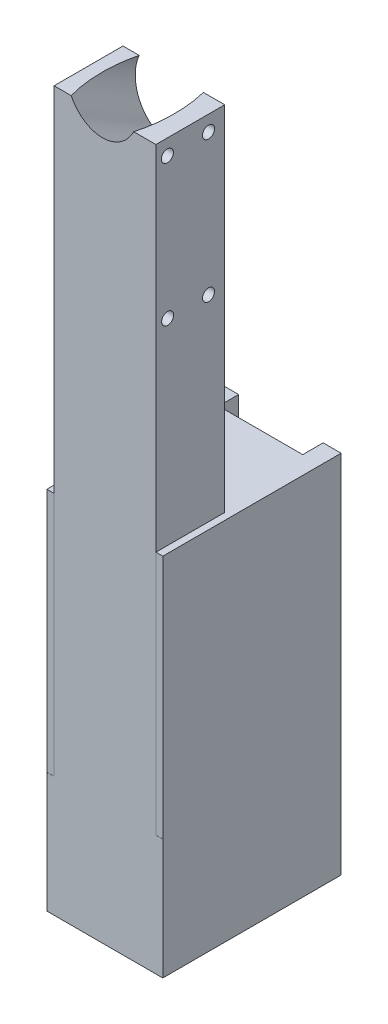
ISO-10303-21;
HEADER;
FILE_DESCRIPTION(('STEP AP214'),'2;1');
FILE_NAME('part.step','',(''),(''),'','','');
FILE_SCHEMA(('AUTOMOTIVE_DESIGN { 1 0 10303 214 1 1 1 1 }'));
ENDSEC;
DATA;
#1=APPLICATION_CONTEXT('core data for automotive mechanical design processes');
#2=APPLICATION_PROTOCOL_DEFINITION('international standard','automotive_design',2000,#1);
#3=PRODUCT_CONTEXT('',#1,'mechanical');
#4=PRODUCT('Part','Part','',(#3));
#5=PRODUCT_RELATED_PRODUCT_CATEGORY('part','',(#4));
#6=PRODUCT_DEFINITION_FORMATION('','',#4);
#7=PRODUCT_DEFINITION_CONTEXT('part definition',#1,'design');
#8=PRODUCT_DEFINITION('design','',#6,#7);
#9=PRODUCT_DEFINITION_SHAPE('','',#8);
#10=(LENGTH_UNIT() NAMED_UNIT(*) SI_UNIT(.MILLI.,.METRE.));
#11=(NAMED_UNIT(*) PLANE_ANGLE_UNIT() SI_UNIT($,.RADIAN.));
#12=(NAMED_UNIT(*) SI_UNIT($,.STERADIAN.) SOLID_ANGLE_UNIT());
#13=UNCERTAINTY_MEASURE_WITH_UNIT(LENGTH_MEASURE(1.E-05),#10,'distance_accuracy_value','');
#14=(GEOMETRIC_REPRESENTATION_CONTEXT(3) GLOBAL_UNCERTAINTY_ASSIGNED_CONTEXT((#13)) GLOBAL_UNIT_ASSIGNED_CONTEXT((#10,
#11,#12)) REPRESENTATION_CONTEXT('',''));
#15=CARTESIAN_POINT('',(0.,0.,0.));
#16=DIRECTION('',(0.,0.,1.));
#17=DIRECTION('',(1.,0.,0.));
#18=AXIS2_PLACEMENT_3D('',#15,#16,#17);
#19=CARTESIAN_POINT('',(19.2072159267695,-16.068623136154,-106.10825784731));
#20=DIRECTION('',(0.,1.,0.));
#21=DIRECTION('',(0.,0.,1.));
#22=AXIS2_PLACEMENT_3D('',#19,#20,#21);
#23=PLANE('',#22);
#24=DIRECTION('',(1.,0.,0.));
#25=VECTOR('',#24,1.);
#26=CARTESIAN_POINT('',(64.4737634161841,-16.068623136154,-158.462370648886));
#27=LINE('',#26,#25);
#28=CARTESIAN_POINT('',(37.2661966694077,-16.068623136154,-158.462370648886));
#29=VERTEX_POINT('',#28);
#30=CARTESIAN_POINT('',(66.1888236800232,-16.068623136154,-158.462370648886));
#31=VERTEX_POINT('',#30);
#32=EDGE_CURVE('E286',#29,#31,#27,.T.);
#33=ORIENTED_EDGE('',*,*,#32,.F.);
#34=DIRECTION('',(0.,0.,1.));
#35=VECTOR('',#34,1.);
#36=CARTESIAN_POINT('',(37.2661966694077,-16.068623136154,-202.871962443775));
#37=LINE('',#36,#35);
#38=CARTESIAN_POINT('',(37.2661966694077,-16.068623136154,-202.871962443775));
#39=VERTEX_POINT('',#38);
#40=EDGE_CURVE('E347',#39,#29,#37,.T.);
#41=ORIENTED_EDGE('',*,*,#40,.F.);
#42=DIRECTION('',(-1.,0.,0.));
#43=VECTOR('',#42,1.);
#44=CARTESIAN_POINT('',(43.7275101747154,-16.068623136154,-202.871962443775));
#45=LINE('',#44,#43);
#46=CARTESIAN_POINT('',(43.7275101747154,-16.068623136154,-202.871962443775));
#47=VERTEX_POINT('',#46);
#48=EDGE_CURVE('E345',#47,#39,#45,.T.);
#49=ORIENTED_EDGE('',*,*,#48,.F.);
#50=DIRECTION('',(0.,0.,-1.));
#51=VECTOR('',#50,1.);
#52=CARTESIAN_POINT('',(43.7275101747154,-16.068623136154,-202.871962443775));
#53=LINE('',#52,#51);
#54=CARTESIAN_POINT('',(43.7275101747154,-16.068623136154,-197.871962443775));
#55=VERTEX_POINT('',#54);
#56=EDGE_CURVE('E343',#55,#47,#53,.T.);
#57=ORIENTED_EDGE('',*,*,#56,.F.);
#58=DIRECTION('',(-1.,0.,0.));
#59=VECTOR('',#58,1.);
#60=CARTESIAN_POINT('',(59.7275101747154,-16.068623136154,-197.871962443775));
#61=LINE('',#60,#59);
#62=CARTESIAN_POINT('',(59.7275101747154,-16.068623136154,-197.871962443775));
#63=VERTEX_POINT('',#62);
#64=EDGE_CURVE('E341',#63,#55,#61,.T.);
#65=ORIENTED_EDGE('',*,*,#64,.F.);
#66=DIRECTION('',(-1.21891695342006E-12,0.,1.));
#67=VECTOR('',#66,1.);
#68=CARTESIAN_POINT('',(59.7275101747154,-16.068623136154,-197.871962443775));
#69=LINE('',#68,#67);
#70=CARTESIAN_POINT('',(59.7275101747217,-16.068623136154,-202.972596182978));
#71=VERTEX_POINT('',#70);
#72=EDGE_CURVE('E339',#71,#63,#69,.T.);
#73=ORIENTED_EDGE('',*,*,#72,.F.);
#74=DIRECTION('',(-1.,0.,0.));
#75=VECTOR('',#74,1.);
#76=CARTESIAN_POINT('',(59.7275101747217,-16.068623136154,-202.972596182978));
#77=LINE('',#76,#75);
#78=CARTESIAN_POINT('',(66.1888236800232,-16.068623136154,-202.972596182978));
#79=VERTEX_POINT('',#78);
#80=EDGE_CURVE('E337',#79,#71,#77,.T.);
#81=ORIENTED_EDGE('',*,*,#80,.F.);
#82=DIRECTION('',(0.,0.,-1.));
#83=VECTOR('',#82,1.);
#84=CARTESIAN_POINT('',(66.1888236800232,-16.068623136154,-158.482956647581));
#85=LINE('',#84,#83);
#86=EDGE_CURVE('E316',#31,#79,#85,.T.);
#87=ORIENTED_EDGE('',*,*,#86,.F.);
#88=EDGE_LOOP('',(#33,#41,#49,#57,#65,#73,#81,#87));
#89=FACE_BOUND('',#88,.T.);
#90=ADVANCED_FACE('F35',(#89),#23,.F.);
#91=CARTESIAN_POINT('',(41.4737634163203,159.320219438313,-161.390944698403));
#92=DIRECTION('',(-1.,0.,0.));
#93=DIRECTION('',(0.,1.,0.));
#94=AXIS2_PLACEMENT_3D('',#91,#92,#93);
#95=PLANE('',#94);
#96=CARTESIAN_POINT('',(41.4737634163203,159.320219438313,-161.390944698403));
#97=DIRECTION('',(1.,0.,0.));
#98=DIRECTION('',(0.,1.,0.));
#99=AXIS2_PLACEMENT_3D('',#96,#97,#98);
#100=CIRCLE('',#99,1.50000000000031);
#101=CARTESIAN_POINT('',(41.4737634163203,160.820219438313,-161.390944698403));
#102=VERTEX_POINT('',#101);
#103=EDGE_CURVE('E240',#102,#102,#100,.T.);
#104=ORIENTED_EDGE('',*,*,#103,.F.);
#105=EDGE_LOOP('',(#104));
#106=FACE_BOUND('',#105,.T.);
#107=ADVANCED_FACE('F497',(#106),#95,.T.);
#108=CARTESIAN_POINT('',(41.4737634163203,159.320219438313,-171.596135726489));
#109=DIRECTION('',(-1.,0.,0.));
#110=DIRECTION('',(0.,1.,0.));
#111=AXIS2_PLACEMENT_3D('',#108,#109,#110);
#112=PLANE('',#111);
#113=CARTESIAN_POINT('',(41.4737634163203,159.320219438313,-171.596135726489));
#114=DIRECTION('',(1.,0.,0.));
#115=DIRECTION('',(0.,1.,0.));
#116=AXIS2_PLACEMENT_3D('',#113,#114,#115);
#117=CIRCLE('',#116,1.50000000000004);
#118=CARTESIAN_POINT('',(41.4737634163203,160.820219438313,-171.596135726489));
#119=VERTEX_POINT('',#118);
#120=EDGE_CURVE('E239',#119,#119,#117,.T.);
#121=ORIENTED_EDGE('',*,*,#120,.F.);
#122=EDGE_LOOP('',(#121));
#123=FACE_BOUND('',#122,.T.);
#124=ADVANCED_FACE('F501',(#123),#112,.T.);
#125=CARTESIAN_POINT('',(46.4737634163201,124.157221503448,-161.390944698403));
#126=DIRECTION('',(-1.,0.,0.));
#127=DIRECTION('',(0.,1.,0.));
#128=AXIS2_PLACEMENT_3D('',#125,#126,#127);
#129=PLANE('',#128);
#130=CARTESIAN_POINT('',(46.4737634163201,124.157221503448,-161.390944698403));
#131=DIRECTION('',(1.,0.,0.));
#132=DIRECTION('',(0.,1.,0.));
#133=AXIS2_PLACEMENT_3D('',#130,#131,#132);
#134=CIRCLE('',#133,1.49999999999993);
#135=CARTESIAN_POINT('',(46.4737634163201,125.657221503448,-161.390944698403));
#136=VERTEX_POINT('',#135);
#137=EDGE_CURVE('E260',#136,#136,#134,.T.);
#138=ORIENTED_EDGE('',*,*,#137,.F.);
#139=EDGE_LOOP('',(#138));
#140=FACE_BOUND('',#139,.T.);
#141=ADVANCED_FACE('F781',(#140),#129,.T.);
#142=CARTESIAN_POINT('',(46.4737634163201,124.157221503448,-171.596135726489));
#143=DIRECTION('',(-1.,0.,0.));
#144=DIRECTION('',(0.,1.,0.));
#145=AXIS2_PLACEMENT_3D('',#142,#143,#144);
#146=PLANE('',#145);
#147=CARTESIAN_POINT('',(46.4737634163201,124.157221503448,-171.596135726489));
#148=DIRECTION('',(1.,0.,0.));
#149=DIRECTION('',(0.,1.,0.));
#150=AXIS2_PLACEMENT_3D('',#147,#148,#149);
#151=CIRCLE('',#150,1.50000000000008);
#152=CARTESIAN_POINT('',(46.4737634163201,125.657221503448,-171.596135726489));
#153=VERTEX_POINT('',#152);
#154=EDGE_CURVE('E259',#153,#153,#151,.T.);
#155=ORIENTED_EDGE('',*,*,#154,.F.);
#156=EDGE_LOOP('',(#155));
#157=FACE_BOUND('',#156,.T.);
#158=ADVANCED_FACE('F771',(#157),#146,.T.);
#159=CARTESIAN_POINT('',(60.8737634163212,159.320219438313,-161.328506709392));
#160=DIRECTION('',(1.,0.,0.));
#161=DIRECTION('',(0.,-1.,0.));
#162=AXIS2_PLACEMENT_3D('',#159,#160,#161);
#163=PLANE('',#162);
#164=CARTESIAN_POINT('',(60.8737634163212,159.320219438313,-161.328506709392));
#165=DIRECTION('',(-1.,0.,0.));
#166=DIRECTION('',(0.,-1.,0.));
#167=AXIS2_PLACEMENT_3D('',#164,#165,#166);
#168=CIRCLE('',#167,1.49999999999987);
#169=CARTESIAN_POINT('',(60.8737634163212,157.820219438313,-161.328506709392));
#170=VERTEX_POINT('',#169);
#171=EDGE_CURVE('E246',#170,#170,#168,.T.);
#172=ORIENTED_EDGE('',*,*,#171,.F.);
#173=EDGE_LOOP('',(#172));
#174=FACE_BOUND('',#173,.T.);
#175=ADVANCED_FACE('F761',(#174),#163,.T.);
#176=CARTESIAN_POINT('',(60.8737634163212,159.320219438313,-171.596135726489));
#177=DIRECTION('',(1.,0.,0.));
#178=DIRECTION('',(0.,-1.,0.));
#179=AXIS2_PLACEMENT_3D('',#176,#177,#178);
#180=PLANE('',#179);
#181=CARTESIAN_POINT('',(60.8737634163212,159.320219438313,-171.596135726489));
#182=DIRECTION('',(-1.,0.,0.));
#183=DIRECTION('',(0.,-1.,0.));
#184=AXIS2_PLACEMENT_3D('',#181,#182,#183);
#185=CIRCLE('',#184,1.50000000000009);
#186=CARTESIAN_POINT('',(60.8737634163212,157.820219438313,-171.596135726489));
#187=VERTEX_POINT('',#186);
#188=EDGE_CURVE('E250',#187,#187,#185,.T.);
#189=ORIENTED_EDGE('',*,*,#188,.F.);
#190=EDGE_LOOP('',(#189));
#191=FACE_BOUND('',#190,.T.);
#192=ADVANCED_FACE('F751',(#191),#180,.T.);
#193=CARTESIAN_POINT('',(55.8737634163213,124.157221503448,-171.596135726489));
#194=DIRECTION('',(1.,0.,0.));
#195=DIRECTION('',(0.,-1.,0.));
#196=AXIS2_PLACEMENT_3D('',#193,#194,#195);
#197=PLANE('',#196);
#198=CARTESIAN_POINT('',(55.8737634163213,124.157221503448,-171.596135726489));
#199=DIRECTION('',(-1.,0.,0.));
#200=DIRECTION('',(0.,-1.,0.));
#201=AXIS2_PLACEMENT_3D('',#198,#199,#200);
#202=CIRCLE('',#201,1.50000000000002);
#203=CARTESIAN_POINT('',(55.8737634163213,122.657221503448,-171.596135726489));
#204=VERTEX_POINT('',#203);
#205=EDGE_CURVE('E266',#204,#204,#202,.T.);
#206=ORIENTED_EDGE('',*,*,#205,.F.);
#207=EDGE_LOOP('',(#206));
#208=FACE_BOUND('',#207,.T.);
#209=ADVANCED_FACE('F741',(#208),#197,.T.);
#210=CARTESIAN_POINT('',(55.8737634163213,124.157221503448,-161.390944698403));
#211=DIRECTION('',(1.,0.,0.));
#212=DIRECTION('',(0.,-1.,0.));
#213=AXIS2_PLACEMENT_3D('',#210,#211,#212);
#214=PLANE('',#213);
#215=CARTESIAN_POINT('',(55.8737634163213,124.157221503448,-161.390944698403));
#216=DIRECTION('',(-1.,0.,0.));
#217=DIRECTION('',(0.,-1.,0.));
#218=AXIS2_PLACEMENT_3D('',#215,#216,#217);
#219=CIRCLE('',#218,1.49999999999989);
#220=CARTESIAN_POINT('',(55.8737634163213,122.657221503448,-161.390944698403));
#221=VERTEX_POINT('',#220);
#222=EDGE_CURVE('E270',#221,#221,#219,.T.);
#223=ORIENTED_EDGE('',*,*,#222,.F.);
#224=EDGE_LOOP('',(#223));
#225=FACE_BOUND('',#224,.T.);
#226=ADVANCED_FACE('F533',(#225),#214,.T.);
#227=CARTESIAN_POINT('',(51.1275101841724,17.3425690277442,-192.871962443775));
#228=DIRECTION('',(0.,0.,-1.));
#229=DIRECTION('',(0.,1.,0.));
#230=AXIS2_PLACEMENT_3D('',#227,#228,#229);
#231=PLANE('',#230);
#232=CARTESIAN_POINT('',(51.1275101841724,17.3425690277442,-192.871962443775));
#233=DIRECTION('',(0.,0.,-1.));
#234=DIRECTION('',(0.,1.,0.));
#235=AXIS2_PLACEMENT_3D('',#232,#233,#234);
#236=CIRCLE('',#235,1.40000000000023);
#237=CARTESIAN_POINT('',(51.1275101841724,18.7425690277445,-192.871962443775));
#238=VERTEX_POINT('',#237);
#239=EDGE_CURVE('E313',#238,#238,#236,.T.);
#240=ORIENTED_EDGE('',*,*,#239,.T.);
#241=EDGE_LOOP('',(#240));
#242=FACE_BOUND('',#241,.T.);
#243=ADVANCED_FACE('F524',(#242),#231,.T.);
#244=CARTESIAN_POINT('',(51.1275101841715,63.1425690277441,-192.871962443775));
#245=DIRECTION('',(0.,0.,-1.));
#246=DIRECTION('',(0.,1.,0.));
#247=AXIS2_PLACEMENT_3D('',#244,#245,#246);
#248=PLANE('',#247);
#249=CARTESIAN_POINT('',(51.1275101841715,63.1425690277441,-192.871962443775));
#250=DIRECTION('',(0.,0.,-1.));
#251=DIRECTION('',(0.,1.,0.));
#252=AXIS2_PLACEMENT_3D('',#249,#250,#251);
#253=CIRCLE('',#252,1.40000000000023);
#254=CARTESIAN_POINT('',(51.1275101841715,64.5425690277443,-192.871962443775));
#255=VERTEX_POINT('',#254);
#256=EDGE_CURVE('E307',#255,#255,#253,.T.);
#257=ORIENTED_EDGE('',*,*,#256,.T.);
#258=EDGE_LOOP('',(#257));
#259=FACE_BOUND('',#258,.T.);
#260=ADVANCED_FACE('F520',(#259),#248,.T.);
#261=CARTESIAN_POINT('',(41.4737634163203,159.320219438313,-161.390944698403));
#262=DIRECTION('',(-1.,0.,0.));
#263=DIRECTION('',(0.,-1.,0.));
#264=AXIS2_PLACEMENT_3D('',#261,#262,#263);
#265=CYLINDRICAL_SURFACE('',#264,1.50000000000031);
#266=ORIENTED_EDGE('',*,*,#103,.T.);
#267=EDGE_LOOP('',(#266));
#268=FACE_BOUND('',#267,.T.);
#269=CARTESIAN_POINT('',(39.0737634161828,159.320219438313,-161.390944698403));
#270=DIRECTION('',(1.,0.,0.));
#271=DIRECTION('',(0.,1.,0.));
#272=AXIS2_PLACEMENT_3D('',#269,#270,#271);
#273=CIRCLE('',#272,1.50000000000031);
#274=CARTESIAN_POINT('',(39.0737634161828,160.820219438313,-161.390944698403));
#275=VERTEX_POINT('',#274);
#276=EDGE_CURVE('E253',#275,#275,#273,.F.);
#277=ORIENTED_EDGE('',*,*,#276,.T.);
#278=EDGE_LOOP('',(#277));
#279=FACE_BOUND('',#278,.T.);
#280=ADVANCED_FACE('F523',(#268,#279),#265,.F.);
#281=CARTESIAN_POINT('',(41.4737634163203,159.320219438313,-171.596135726489));
#282=DIRECTION('',(-1.,0.,0.));
#283=DIRECTION('',(0.,-1.,0.));
#284=AXIS2_PLACEMENT_3D('',#281,#282,#283);
#285=CYLINDRICAL_SURFACE('',#284,1.50000000000004);
#286=ORIENTED_EDGE('',*,*,#120,.T.);
#287=EDGE_LOOP('',(#286));
#288=FACE_BOUND('',#287,.T.);
#289=CARTESIAN_POINT('',(39.0737634161828,159.320219438313,-171.596135726489));
#290=DIRECTION('',(1.,0.,0.));
#291=DIRECTION('',(0.,1.,0.));
#292=AXIS2_PLACEMENT_3D('',#289,#290,#291);
#293=CIRCLE('',#292,1.50000000000004);
#294=CARTESIAN_POINT('',(39.0737634161828,160.820219438313,-171.596135726489));
#295=VERTEX_POINT('',#294);
#296=EDGE_CURVE('E243',#295,#295,#293,.F.);
#297=ORIENTED_EDGE('',*,*,#296,.T.);
#298=EDGE_LOOP('',(#297));
#299=FACE_BOUND('',#298,.T.);
#300=ADVANCED_FACE('F701',(#288,#299),#285,.F.);
#301=CARTESIAN_POINT('',(23.4737634163205,124.157221503448,-161.390944698403));
#302=DIRECTION('',(1.,0.,0.));
#303=DIRECTION('',(0.,1.,0.));
#304=AXIS2_PLACEMENT_3D('',#301,#302,#303);
#305=CYLINDRICAL_SURFACE('',#304,1.49999999999993);
#306=ORIENTED_EDGE('',*,*,#137,.T.);
#307=EDGE_LOOP('',(#306));
#308=FACE_BOUND('',#307,.T.);
#309=CARTESIAN_POINT('',(39.0737634161828,124.157221503448,-161.390944698403));
#310=DIRECTION('',(1.,0.,0.));
#311=DIRECTION('',(0.,1.,0.));
#312=AXIS2_PLACEMENT_3D('',#309,#310,#311);
#313=CIRCLE('',#312,1.49999999999993);
#314=CARTESIAN_POINT('',(39.0737634161828,125.657221503448,-161.390944698403));
#315=VERTEX_POINT('',#314);
#316=EDGE_CURVE('E273',#315,#315,#313,.T.);
#317=ORIENTED_EDGE('',*,*,#316,.F.);
#318=EDGE_LOOP('',(#317));
#319=FACE_BOUND('',#318,.T.);
#320=ADVANCED_FACE('F691',(#308,#319),#305,.F.);
#321=CARTESIAN_POINT('',(23.4737634163205,124.157221503448,-171.596135726489));
#322=DIRECTION('',(1.,0.,0.));
#323=DIRECTION('',(0.,1.,0.));
#324=AXIS2_PLACEMENT_3D('',#321,#322,#323);
#325=CYLINDRICAL_SURFACE('',#324,1.50000000000008);
#326=ORIENTED_EDGE('',*,*,#154,.T.);
#327=EDGE_LOOP('',(#326));
#328=FACE_BOUND('',#327,.T.);
#329=CARTESIAN_POINT('',(39.0737634161828,124.157221503448,-171.596135726489));
#330=DIRECTION('',(1.,0.,0.));
#331=DIRECTION('',(0.,1.,0.));
#332=AXIS2_PLACEMENT_3D('',#329,#330,#331);
#333=CIRCLE('',#332,1.50000000000008);
#334=CARTESIAN_POINT('',(39.0737634161828,125.657221503448,-171.596135726489));
#335=VERTEX_POINT('',#334);
#336=EDGE_CURVE('E263',#335,#335,#333,.T.);
#337=ORIENTED_EDGE('',*,*,#336,.F.);
#338=EDGE_LOOP('',(#337));
#339=FACE_BOUND('',#338,.T.);
#340=ADVANCED_FACE('F519',(#328,#339),#325,.F.);
#341=CARTESIAN_POINT('',(64.4737634161841,193.866566084655,-175.642963086767));
#342=DIRECTION('',(0.,0.,1.));
#343=DIRECTION('',(0.,-1.,0.));
#344=AXIS2_PLACEMENT_3D('',#341,#342,#343);
#345=PLANE('',#344);
#346=CARTESIAN_POINT('',(51.1332311807804,158.467282147258,-175.642963086767));
#347=DIRECTION('',(0.,0.,1.));
#348=DIRECTION('',(0.,1.,0.));
#349=AXIS2_PLACEMENT_3D('',#346,#347,#348);
#350=ELLIPSE('',#349,10.3923048454137,9.00000000000035);
#351=CARTESIAN_POINT('',(59.1450237592159,163.20172047088,-175.642963086767));
#352=VERTEX_POINT('',#351);
#353=CARTESIAN_POINT('',(43.1214386023449,163.20172047088,-175.642963086767));
#354=VERTEX_POINT('',#353);
#355=EDGE_CURVE('E254',#352,#354,#350,.F.);
#356=ORIENTED_EDGE('',*,*,#355,.F.);
#357=DIRECTION('',(1.,0.,0.));
#358=VECTOR('',#357,1.);
#359=CARTESIAN_POINT('',(64.4737634161841,163.20172047088,-175.642963086767));
#360=LINE('',#359,#358);
#361=CARTESIAN_POINT('',(64.4737634161841,163.20172047088,-175.642963086767));
#362=VERTEX_POINT('',#361);
#363=EDGE_CURVE('E281',#352,#362,#360,.T.);
#364=ORIENTED_EDGE('',*,*,#363,.T.);
#365=DIRECTION('',(0.,-1.,0.));
#366=VECTOR('',#365,1.);
#367=CARTESIAN_POINT('',(64.4737634161841,193.866566084655,-175.642963086767));
#368=LINE('',#367,#366);
#369=CARTESIAN_POINT('',(64.4737634161841,75.0913768638464,-175.642963086767));
#370=VERTEX_POINT('',#369);
#371=EDGE_CURVE('E289',#362,#370,#368,.T.);
#372=ORIENTED_EDGE('',*,*,#371,.T.);
#373=DIRECTION('',(1.,0.,0.));
#374=VECTOR('',#373,1.);
#375=CARTESIAN_POINT('',(-4650.0806785395,75.0913768638464,-175.642963086767));
#376=LINE('',#375,#374);
#377=CARTESIAN_POINT('',(39.0737634161828,75.0913768638464,-175.642963086767));
#378=VERTEX_POINT('',#377);
#379=EDGE_CURVE('E369',#378,#370,#376,.T.);
#380=ORIENTED_EDGE('',*,*,#379,.F.);
#381=DIRECTION('',(0.,-1.,0.));
#382=VECTOR('',#381,1.);
#383=CARTESIAN_POINT('',(39.0737634161828,193.866566084655,-175.642963086767));
#384=LINE('',#383,#382);
#385=CARTESIAN_POINT('',(39.0737634161828,163.20172047088,-175.642963086767));
#386=VERTEX_POINT('',#385);
#387=EDGE_CURVE('E297',#386,#378,#384,.T.);
#388=ORIENTED_EDGE('',*,*,#387,.F.);
#389=EDGE_CURVE('E282',#386,#354,#360,.T.);
#390=ORIENTED_EDGE('',*,*,#389,.T.);
#391=EDGE_LOOP('',(#356,#364,#372,#380,#388,#390));
#392=FACE_BOUND('',#391,.T.);
#393=ADVANCED_FACE('F407',(#392),#345,.F.);
#394=CARTESIAN_POINT('',(66.8737634163215,159.320219438313,-161.328506709392));
#395=DIRECTION('',(-1.,0.,0.));
#396=DIRECTION('',(0.,-1.,0.));
#397=AXIS2_PLACEMENT_3D('',#394,#395,#396);
#398=CYLINDRICAL_SURFACE('',#397,1.49999999999987);
#399=ORIENTED_EDGE('',*,*,#171,.T.);
#400=EDGE_LOOP('',(#399));
#401=FACE_BOUND('',#400,.T.);
#402=CARTESIAN_POINT('',(64.4737634161841,159.320219438313,-161.328506709392));
#403=DIRECTION('',(-1.,0.,0.));
#404=DIRECTION('',(0.,-1.,0.));
#405=AXIS2_PLACEMENT_3D('',#402,#403,#404);
#406=CIRCLE('',#405,1.49999999999987);
#407=CARTESIAN_POINT('',(64.4737634161841,157.820219438313,-161.328506709392));
#408=VERTEX_POINT('',#407);
#409=EDGE_CURVE('E257',#408,#408,#406,.T.);
#410=ORIENTED_EDGE('',*,*,#409,.F.);
#411=EDGE_LOOP('',(#410));
#412=FACE_BOUND('',#411,.T.);
#413=ADVANCED_FACE('F518',(#401,#412),#398,.F.);
#414=CARTESIAN_POINT('',(66.8737634163215,159.320219438313,-171.596135726489));
#415=DIRECTION('',(-1.,0.,0.));
#416=DIRECTION('',(0.,-1.,0.));
#417=AXIS2_PLACEMENT_3D('',#414,#415,#416);
#418=CYLINDRICAL_SURFACE('',#417,1.50000000000009);
#419=ORIENTED_EDGE('',*,*,#188,.T.);
#420=EDGE_LOOP('',(#419));
#421=FACE_BOUND('',#420,.T.);
#422=CARTESIAN_POINT('',(64.4737634161841,159.320219438313,-171.596135726489));
#423=DIRECTION('',(-1.,0.,0.));
#424=DIRECTION('',(0.,-1.,0.));
#425=AXIS2_PLACEMENT_3D('',#422,#423,#424);
#426=CIRCLE('',#425,1.50000000000009);
#427=CARTESIAN_POINT('',(64.4737634161841,157.820219438313,-171.596135726489));
#428=VERTEX_POINT('',#427);
#429=EDGE_CURVE('E249',#428,#428,#426,.T.);
#430=ORIENTED_EDGE('',*,*,#429,.F.);
#431=EDGE_LOOP('',(#430));
#432=FACE_BOUND('',#431,.T.);
#433=ADVANCED_FACE('F657',(#421,#432),#418,.F.);
#434=CARTESIAN_POINT('',(81.5682094183554,124.157221503448,-171.596135726489));
#435=DIRECTION('',(-1.,0.,0.));
#436=DIRECTION('',(0.,-1.,0.));
#437=AXIS2_PLACEMENT_3D('',#434,#435,#436);
#438=CYLINDRICAL_SURFACE('',#437,1.50000000000002);
#439=ORIENTED_EDGE('',*,*,#205,.T.);
#440=EDGE_LOOP('',(#439));
#441=FACE_BOUND('',#440,.T.);
#442=CARTESIAN_POINT('',(64.4737634161841,124.157221503448,-171.596135726489));
#443=DIRECTION('',(-1.,0.,0.));
#444=DIRECTION('',(0.,-1.,0.));
#445=AXIS2_PLACEMENT_3D('',#442,#443,#444);
#446=CIRCLE('',#445,1.50000000000002);
#447=CARTESIAN_POINT('',(64.4737634161841,122.657221503448,-171.596135726489));
#448=VERTEX_POINT('',#447);
#449=EDGE_CURVE('E290',#448,#448,#446,.T.);
#450=ORIENTED_EDGE('',*,*,#449,.F.);
#451=EDGE_LOOP('',(#450));
#452=FACE_BOUND('',#451,.T.);
#453=ADVANCED_FACE('F646',(#441,#452),#438,.F.);
#454=CARTESIAN_POINT('',(81.5682094183554,124.157221503448,-161.390944698403));
#455=DIRECTION('',(-1.,0.,0.));
#456=DIRECTION('',(0.,-1.,0.));
#457=AXIS2_PLACEMENT_3D('',#454,#455,#456);
#458=CYLINDRICAL_SURFACE('',#457,1.49999999999989);
#459=ORIENTED_EDGE('',*,*,#222,.T.);
#460=EDGE_LOOP('',(#459));
#461=FACE_BOUND('',#460,.T.);
#462=CARTESIAN_POINT('',(64.4737634161841,124.157221503448,-161.390944698403));
#463=DIRECTION('',(-1.,0.,0.));
#464=DIRECTION('',(0.,-1.,0.));
#465=AXIS2_PLACEMENT_3D('',#462,#463,#464);
#466=CIRCLE('',#465,1.49999999999989);
#467=CARTESIAN_POINT('',(64.4737634161841,122.657221503448,-161.390944698403));
#468=VERTEX_POINT('',#467);
#469=EDGE_CURVE('E269',#468,#468,#466,.T.);
#470=ORIENTED_EDGE('',*,*,#469,.F.);
#471=EDGE_LOOP('',(#470));
#472=FACE_BOUND('',#471,.T.);
#473=ADVANCED_FACE('F539',(#461,#472),#458,.F.);
#474=CARTESIAN_POINT('',(59.7275101747154,75.0913768638464,-158.482956647581));
#475=DIRECTION('',(0.,0.,-1.));
#476=DIRECTION('',(0.,1.,0.));
#477=AXIS2_PLACEMENT_3D('',#474,#475,#476);
#478=PLANE('',#477);
#479=DIRECTION('',(1.,0.,0.));
#480=VECTOR('',#479,1.);
#481=CARTESIAN_POINT('',(37.2661966694077,13.9313768638463,-158.482956647581));
#482=LINE('',#481,#480);
#483=CARTESIAN_POINT('',(64.4737634161841,13.9313768638463,-158.482956647581));
#484=VERTEX_POINT('',#483);
#485=CARTESIAN_POINT('',(66.1888236800232,13.9313768638463,-158.482956647581));
#486=VERTEX_POINT('',#485);
#487=EDGE_CURVE('E213',#484,#486,#482,.T.);
#488=ORIENTED_EDGE('',*,*,#487,.T.);
#489=DIRECTION('',(0.,-1.,0.));
#490=VECTOR('',#489,1.);
#491=CARTESIAN_POINT('',(66.1888236800232,75.0913768638464,-158.482956647581));
#492=LINE('',#491,#490);
#493=CARTESIAN_POINT('',(66.1888236800232,75.0913768638464,-158.482956647581));
#494=VERTEX_POINT('',#493);
#495=EDGE_CURVE('E366',#494,#486,#492,.T.);
#496=ORIENTED_EDGE('',*,*,#495,.F.);
#497=DIRECTION('',(1.,0.,0.));
#498=VECTOR('',#497,1.);
#499=CARTESIAN_POINT('',(59.7275101747154,75.0913768638464,-158.482956647581));
#500=LINE('',#499,#498);
#501=CARTESIAN_POINT('',(64.4737634161841,75.0913768638464,-158.482956647581));
#502=VERTEX_POINT('',#501);
#503=EDGE_CURVE('E323',#502,#494,#500,.T.);
#504=ORIENTED_EDGE('',*,*,#503,.F.);
#505=DIRECTION('',(0.,1.,0.));
#506=VECTOR('',#505,1.);
#507=CARTESIAN_POINT('',(64.4737634161841,75.0913768638464,-158.482956647581));
#508=LINE('',#507,#506);
#509=EDGE_CURVE('E304',#484,#502,#508,.T.);
#510=ORIENTED_EDGE('',*,*,#509,.F.);
#511=EDGE_LOOP('',(#488,#496,#504,#510));
#512=FACE_BOUND('',#511,.T.);
#513=ADVANCED_FACE('F455',(#512),#478,.F.);
#514=CARTESIAN_POINT('',(59.7275101747217,75.0913768638464,-202.972596182978));
#515=DIRECTION('',(0.,0.,1.));
#516=DIRECTION('',(0.,-1.,0.));
#517=AXIS2_PLACEMENT_3D('',#514,#515,#516);
#518=PLANE('',#517);
#519=DIRECTION('',(0.,-1.,0.));
#520=VECTOR('',#519,1.);
#521=CARTESIAN_POINT('',(59.7275101747217,75.0913768638464,-202.972596182978));
#522=LINE('',#521,#520);
#523=CARTESIAN_POINT('',(59.7275101747217,3.30098404346657,-202.972596182978));
#524=VERTEX_POINT('',#523);
#525=EDGE_CURVE('E360',#524,#71,#522,.T.);
#526=ORIENTED_EDGE('',*,*,#525,.F.);
#527=DIRECTION('',(-1.,0.,0.));
#528=VECTOR('',#527,1.);
#529=CARTESIAN_POINT('',(61.7050715411658,3.30098404346657,-202.972596182978));
#530=LINE('',#529,#528);
#531=CARTESIAN_POINT('',(61.7050715411658,3.30098404346657,-202.972596182978));
#532=VERTEX_POINT('',#531);
#533=EDGE_CURVE('E49',#532,#524,#530,.T.);
#534=ORIENTED_EDGE('',*,*,#533,.F.);
#535=DIRECTION('',(0.,-1.,0.));
#536=VECTOR('',#535,1.);
#537=CARTESIAN_POINT('',(61.7050715411658,75.0913768638464,-202.972596182978));
#538=LINE('',#537,#536);
#539=CARTESIAN_POINT('',(61.7050715411658,75.0913768638464,-202.972596182978));
#540=VERTEX_POINT('',#539);
#541=EDGE_CURVE('E462',#540,#532,#538,.T.);
#542=ORIENTED_EDGE('',*,*,#541,.F.);
#543=DIRECTION('',(-1.,0.,0.));
#544=VECTOR('',#543,1.);
#545=CARTESIAN_POINT('',(59.7275101747217,75.0913768638464,-202.972596182978));
#546=LINE('',#545,#544);
#547=CARTESIAN_POINT('',(66.1888236800232,75.0913768638464,-202.972596182978));
#548=VERTEX_POINT('',#547);
#549=EDGE_CURVE('E325',#548,#540,#546,.T.);
#550=ORIENTED_EDGE('',*,*,#549,.F.);
#551=DIRECTION('',(0.,-1.,0.));
#552=VECTOR('',#551,1.);
#553=CARTESIAN_POINT('',(66.1888236800232,75.0913768638464,-202.972596182978));
#554=LINE('',#553,#552);
#555=EDGE_CURVE('E363',#548,#79,#554,.T.);
#556=ORIENTED_EDGE('',*,*,#555,.T.);
#557=ORIENTED_EDGE('',*,*,#80,.T.);
#558=EDGE_LOOP('',(#526,#534,#542,#550,#556,#557));
#559=FACE_BOUND('',#558,.T.);
#560=ADVANCED_FACE('F460',(#559),#518,.F.);
#561=CARTESIAN_POINT('',(51.1275101841724,17.3425690277442,-192.871962443775));
#562=DIRECTION('',(0.,0.,-1.));
#563=DIRECTION('',(0.,1.,0.));
#564=AXIS2_PLACEMENT_3D('',#561,#562,#563);
#565=CYLINDRICAL_SURFACE('',#564,1.40000000000023);
#566=ORIENTED_EDGE('',*,*,#239,.F.);
#567=EDGE_LOOP('',(#566));
#568=FACE_BOUND('',#567,.T.);
#569=CARTESIAN_POINT('',(51.1275101841724,17.3425690277442,-197.871962443775));
#570=DIRECTION('',(0.,0.,-1.));
#571=DIRECTION('',(0.,1.,0.));
#572=AXIS2_PLACEMENT_3D('',#569,#570,#571);
#573=CIRCLE('',#572,1.40000000000023);
#574=CARTESIAN_POINT('',(51.1275101841724,18.7425690277445,-197.871962443775));
#575=VERTEX_POINT('',#574);
#576=EDGE_CURVE('E310',#575,#575,#573,.T.);
#577=ORIENTED_EDGE('',*,*,#576,.T.);
#578=EDGE_LOOP('',(#577));
#579=FACE_BOUND('',#578,.T.);
#580=ADVANCED_FACE('F529',(#568,#579),#565,.F.);
#581=CARTESIAN_POINT('',(51.1275101841715,63.1425690277441,-192.871962443775));
#582=DIRECTION('',(0.,0.,-1.));
#583=DIRECTION('',(0.,1.,0.));
#584=AXIS2_PLACEMENT_3D('',#581,#582,#583);
#585=CYLINDRICAL_SURFACE('',#584,1.40000000000023);
#586=ORIENTED_EDGE('',*,*,#256,.F.);
#587=EDGE_LOOP('',(#586));
#588=FACE_BOUND('',#587,.T.);
#589=CARTESIAN_POINT('',(51.1275101841715,63.1425690277441,-197.871962443775));
#590=DIRECTION('',(0.,0.,-1.));
#591=DIRECTION('',(0.,1.,0.));
#592=AXIS2_PLACEMENT_3D('',#589,#590,#591);
#593=CIRCLE('',#592,1.40000000000023);
#594=CARTESIAN_POINT('',(51.1275101841715,64.5425690277443,-197.871962443775));
#595=VERTEX_POINT('',#594);
#596=EDGE_CURVE('E306',#595,#595,#593,.T.);
#597=ORIENTED_EDGE('',*,*,#596,.T.);
#598=EDGE_LOOP('',(#597));
#599=FACE_BOUND('',#598,.T.);
#600=ADVANCED_FACE('F526',(#588,#599),#585,.F.);
#601=CARTESIAN_POINT('',(59.7275101747154,75.0913768638464,-197.871962443775));
#602=DIRECTION('',(1.,0.,1.21891695342006E-12));
#603=DIRECTION('',(1.21891695342006E-12,0.,-1.));
#604=AXIS2_PLACEMENT_3D('',#601,#602,#603);
#605=PLANE('',#604);
#606=DIRECTION('',(0.,-1.,0.));
#607=VECTOR('',#606,1.);
#608=CARTESIAN_POINT('',(59.7275101747154,75.0913768638464,-197.871962443775));
#609=LINE('',#608,#607);
#610=CARTESIAN_POINT('',(59.7275101747154,3.30098404346657,-197.871962443775));
#611=VERTEX_POINT('',#610);
#612=EDGE_CURVE('E357',#611,#63,#609,.T.);
#613=ORIENTED_EDGE('',*,*,#612,.F.);
#614=DIRECTION('',(1.21891695342006E-12,0.,-1.));
#615=VECTOR('',#614,1.);
#616=CARTESIAN_POINT('',(59.7275101747154,3.30098404346657,-197.871962443775));
#617=LINE('',#616,#615);
#618=EDGE_CURVE('E211',#611,#524,#617,.T.);
#619=ORIENTED_EDGE('',*,*,#618,.T.);
#620=ORIENTED_EDGE('',*,*,#525,.T.);
#621=ORIENTED_EDGE('',*,*,#72,.T.);
#622=EDGE_LOOP('',(#613,#619,#620,#621));
#623=FACE_BOUND('',#622,.T.);
#624=ADVANCED_FACE('F476',(#623),#605,.F.);
#625=CARTESIAN_POINT('',(61.7050715411658,3.30098404346657,-123.075531047513));
#626=DIRECTION('',(0.,-1.,0.));
#627=DIRECTION('',(0.,0.,-1.));
#628=AXIS2_PLACEMENT_3D('',#625,#626,#627);
#629=PLANE('',#628);
#630=DIRECTION('',(-1.,0.,0.));
#631=VECTOR('',#630,1.);
#632=CARTESIAN_POINT('',(61.7050715411658,3.30098404346657,-197.871962443775));
#633=LINE('',#632,#631);
#634=CARTESIAN_POINT('',(61.7050715411658,3.30098404346657,-197.871962443775));
#635=VERTEX_POINT('',#634);
#636=EDGE_CURVE('E192',#635,#611,#633,.T.);
#637=ORIENTED_EDGE('',*,*,#636,.F.);
#638=DIRECTION('',(0.,0.,-1.));
#639=VECTOR('',#638,1.);
#640=CARTESIAN_POINT('',(61.7050715411658,3.30098404346657,-123.075531047513));
#641=LINE('',#640,#639);
#642=EDGE_CURVE('E206',#635,#532,#641,.T.);
#643=ORIENTED_EDGE('',*,*,#642,.T.);
#644=ORIENTED_EDGE('',*,*,#533,.T.);
#645=ORIENTED_EDGE('',*,*,#618,.F.);
#646=EDGE_LOOP('',(#637,#643,#644,#645));
#647=FACE_BOUND('',#646,.T.);
#648=ADVANCED_FACE('F478',(#647),#629,.F.);
#649=CARTESIAN_POINT('',(61.7050715411658,75.0913768638464,-123.075531047513));
#650=DIRECTION('',(1.,0.,0.));
#651=DIRECTION('',(0.,0.,-1.));
#652=AXIS2_PLACEMENT_3D('',#649,#650,#651);
#653=PLANE('',#652);
#654=DIRECTION('',(0.,0.,-1.));
#655=VECTOR('',#654,1.);
#656=CARTESIAN_POINT('',(61.7050715411658,75.0913768638464,-123.075531047513));
#657=LINE('',#656,#655);
#658=CARTESIAN_POINT('',(61.7050715411658,75.0913768638464,-197.871962443775));
#659=VERTEX_POINT('',#658);
#660=EDGE_CURVE('E464',#659,#540,#657,.T.);
#661=ORIENTED_EDGE('',*,*,#660,.T.);
#662=ORIENTED_EDGE('',*,*,#541,.T.);
#663=ORIENTED_EDGE('',*,*,#642,.F.);
#664=DIRECTION('',(0.,-1.,0.));
#665=VECTOR('',#664,1.);
#666=CARTESIAN_POINT('',(61.7050715411658,75.0913768638464,-197.871962443775));
#667=LINE('',#666,#665);
#668=EDGE_CURVE('E209',#659,#635,#667,.T.);
#669=ORIENTED_EDGE('',*,*,#668,.F.);
#670=EDGE_LOOP('',(#661,#662,#663,#669));
#671=FACE_BOUND('',#670,.T.);
#672=ADVANCED_FACE('F472',(#671),#653,.F.);
#673=CARTESIAN_POINT('',(59.7275101747154,75.0913768638464,-197.871962443775));
#674=DIRECTION('',(0.,0.,1.));
#675=DIRECTION('',(0.,-1.,0.));
#676=AXIS2_PLACEMENT_3D('',#673,#674,#675);
#677=PLANE('',#676);
#678=DIRECTION('',(0.,-1.,0.));
#679=VECTOR('',#678,1.);
#680=CARTESIAN_POINT('',(43.7275101747154,75.0913768638464,-197.871962443775));
#681=LINE('',#680,#679);
#682=CARTESIAN_POINT('',(43.7275101747154,3.30098404346657,-197.871962443775));
#683=VERTEX_POINT('',#682);
#684=EDGE_CURVE('E189',#683,#55,#681,.T.);
#685=ORIENTED_EDGE('',*,*,#684,.F.);
#686=CARTESIAN_POINT('',(40.7135101816261,3.30098404346657,-197.871962443775));
#687=VERTEX_POINT('',#686);
#688=EDGE_CURVE('E184',#683,#687,#633,.T.);
#689=ORIENTED_EDGE('',*,*,#688,.T.);
#690=DIRECTION('',(0.,1.,0.));
#691=VECTOR('',#690,1.);
#692=CARTESIAN_POINT('',(40.7135101816261,75.0913768638464,-197.871962443775));
#693=LINE('',#692,#691);
#694=CARTESIAN_POINT('',(40.7135101816261,75.0913768638464,-197.871962443775));
#695=VERTEX_POINT('',#694);
#696=EDGE_CURVE('E187',#687,#695,#693,.T.);
#697=ORIENTED_EDGE('',*,*,#696,.T.);
#698=DIRECTION('',(-1.,0.,0.));
#699=VECTOR('',#698,1.);
#700=CARTESIAN_POINT('',(59.7275101747154,75.0913768638464,-197.871962443775));
#701=LINE('',#700,#699);
#702=EDGE_CURVE('E328',#659,#695,#701,.T.);
#703=ORIENTED_EDGE('',*,*,#702,.F.);
#704=ORIENTED_EDGE('',*,*,#668,.T.);
#705=ORIENTED_EDGE('',*,*,#636,.T.);
#706=ORIENTED_EDGE('',*,*,#612,.T.);
#707=ORIENTED_EDGE('',*,*,#64,.T.);
#708=EDGE_LOOP('',(#685,#689,#697,#703,#704,#705,#706,#707));
#709=FACE_BOUND('',#708,.T.);
#710=ORIENTED_EDGE('',*,*,#596,.F.);
#711=EDGE_LOOP('',(#710));
#712=FACE_BOUND('',#711,.T.);
#713=ORIENTED_EDGE('',*,*,#576,.F.);
#714=EDGE_LOOP('',(#713));
#715=FACE_BOUND('',#714,.T.);
#716=ADVANCED_FACE('F185',(#709,#712,#715),#677,.F.);
#717=CARTESIAN_POINT('',(43.7275101747154,75.0913768638464,-202.871962443775));
#718=DIRECTION('',(-1.,0.,0.));
#719=DIRECTION('',(0.,-1.,0.));
#720=AXIS2_PLACEMENT_3D('',#717,#718,#719);
#721=PLANE('',#720);
#722=DIRECTION('',(0.,-1.,0.));
#723=VECTOR('',#722,1.);
#724=CARTESIAN_POINT('',(43.7275101747154,75.0913768638464,-202.871962443775));
#725=LINE('',#724,#723);
#726=CARTESIAN_POINT('',(43.7275101747154,3.30098404346657,-202.871962443775));
#727=VERTEX_POINT('',#726);
#728=EDGE_CURVE('E353',#727,#47,#725,.T.);
#729=ORIENTED_EDGE('',*,*,#728,.F.);
#730=DIRECTION('',(0.,0.,1.));
#731=VECTOR('',#730,1.);
#732=CARTESIAN_POINT('',(43.7275101747154,3.30098404346657,-202.871962443775));
#733=LINE('',#732,#731);
#734=EDGE_CURVE('E208',#727,#683,#733,.T.);
#735=ORIENTED_EDGE('',*,*,#734,.T.);
#736=ORIENTED_EDGE('',*,*,#684,.T.);
#737=ORIENTED_EDGE('',*,*,#56,.T.);
#738=EDGE_LOOP('',(#729,#735,#736,#737));
#739=FACE_BOUND('',#738,.T.);
#740=ADVANCED_FACE('F483',(#739),#721,.F.);
#741=DIRECTION('',(1.,0.,0.));
#742=VECTOR('',#741,1.);
#743=CARTESIAN_POINT('',(43.7275101747154,3.30098404346657,-202.871962443775));
#744=LINE('',#743,#742);
#745=CARTESIAN_POINT('',(40.7135101816261,3.30098404346657,-202.871962443775));
#746=VERTEX_POINT('',#745);
#747=EDGE_CURVE('E11',#746,#727,#744,.T.);
#748=ORIENTED_EDGE('',*,*,#747,.F.);
#749=DIRECTION('',(0.,0.,-1.));
#750=VECTOR('',#749,1.);
#751=CARTESIAN_POINT('',(40.7135101816261,3.30098404346657,-123.075531047513));
#752=LINE('',#751,#750);
#753=EDGE_CURVE('E57',#687,#746,#752,.T.);
#754=ORIENTED_EDGE('',*,*,#753,.F.);
#755=ORIENTED_EDGE('',*,*,#688,.F.);
#756=ORIENTED_EDGE('',*,*,#734,.F.);
#757=EDGE_LOOP('',(#748,#754,#755,#756));
#758=FACE_BOUND('',#757,.T.);
#759=ADVANCED_FACE('F199',(#758),#629,.F.);
#760=CARTESIAN_POINT('',(40.7135101816261,75.0913768638464,-123.075531047513));
#761=DIRECTION('',(-1.,0.,0.));
#762=DIRECTION('',(0.,0.,1.));
#763=AXIS2_PLACEMENT_3D('',#760,#761,#762);
#764=PLANE('',#763);
#765=DIRECTION('',(0.,0.,-1.));
#766=VECTOR('',#765,1.);
#767=CARTESIAN_POINT('',(40.7135101816261,75.0913768638464,-123.075531047513));
#768=LINE('',#767,#766);
#769=CARTESIAN_POINT('',(40.7135101816261,75.0913768638464,-202.871962443775));
#770=VERTEX_POINT('',#769);
#771=EDGE_CURVE('E197',#695,#770,#768,.T.);
#772=ORIENTED_EDGE('',*,*,#771,.F.);
#773=ORIENTED_EDGE('',*,*,#696,.F.);
#774=ORIENTED_EDGE('',*,*,#753,.T.);
#775=DIRECTION('',(0.,-1.,0.));
#776=VECTOR('',#775,1.);
#777=CARTESIAN_POINT('',(40.7135101816261,75.0913768638464,-202.871962443775));
#778=LINE('',#777,#776);
#779=EDGE_CURVE('E42',#770,#746,#778,.T.);
#780=ORIENTED_EDGE('',*,*,#779,.F.);
#781=EDGE_LOOP('',(#772,#773,#774,#780));
#782=FACE_BOUND('',#781,.T.);
#783=ADVANCED_FACE('F195',(#782),#764,.F.);
#784=CARTESIAN_POINT('',(43.7275101747154,75.0913768638464,-202.871962443775));
#785=DIRECTION('',(0.,0.,1.));
#786=DIRECTION('',(0.,-1.,0.));
#787=AXIS2_PLACEMENT_3D('',#784,#785,#786);
#788=PLANE('',#787);
#789=ORIENTED_EDGE('',*,*,#779,.T.);
#790=ORIENTED_EDGE('',*,*,#747,.T.);
#791=ORIENTED_EDGE('',*,*,#728,.T.);
#792=ORIENTED_EDGE('',*,*,#48,.T.);
#793=DIRECTION('',(0.,-1.,0.));
#794=VECTOR('',#793,1.);
#795=CARTESIAN_POINT('',(37.2661966694077,75.0913768638464,-202.871962443775));
#796=LINE('',#795,#794);
#797=CARTESIAN_POINT('',(37.2661966694077,75.0913768638464,-202.871962443775));
#798=VERTEX_POINT('',#797);
#799=EDGE_CURVE('E350',#798,#39,#796,.T.);
#800=ORIENTED_EDGE('',*,*,#799,.F.);
#801=DIRECTION('',(-1.,0.,0.));
#802=VECTOR('',#801,1.);
#803=CARTESIAN_POINT('',(43.7275101747154,75.0913768638464,-202.871962443775));
#804=LINE('',#803,#802);
#805=EDGE_CURVE('E330',#770,#798,#804,.T.);
#806=ORIENTED_EDGE('',*,*,#805,.F.);
#807=EDGE_LOOP('',(#789,#790,#791,#792,#800,#806));
#808=FACE_BOUND('',#807,.T.);
#809=ADVANCED_FACE('F484',(#808),#788,.F.);
#810=CARTESIAN_POINT('',(-4650.0806785395,75.0913768638464,-214.642963086767));
#811=DIRECTION('',(0.,1.,0.));
#812=DIRECTION('',(0.,0.,1.));
#813=AXIS2_PLACEMENT_3D('',#810,#811,#812);
#814=PLANE('',#813);
#815=ORIENTED_EDGE('',*,*,#702,.T.);
#816=ORIENTED_EDGE('',*,*,#771,.T.);
#817=ORIENTED_EDGE('',*,*,#805,.T.);
#818=DIRECTION('',(0.,0.,1.));
#819=VECTOR('',#818,1.);
#820=CARTESIAN_POINT('',(37.2661966694077,75.0913768638464,-202.871962443775));
#821=LINE('',#820,#819);
#822=CARTESIAN_POINT('',(37.2661966694077,75.0913768638464,-158.482956647581));
#823=VERTEX_POINT('',#822);
#824=EDGE_CURVE('E332',#798,#823,#821,.T.);
#825=ORIENTED_EDGE('',*,*,#824,.T.);
#826=CARTESIAN_POINT('',(39.0737634161828,75.0913768638464,-158.482956647581));
#827=VERTEX_POINT('',#826);
#828=EDGE_CURVE('E319',#823,#827,#500,.T.);
#829=ORIENTED_EDGE('',*,*,#828,.T.);
#830=DIRECTION('',(0.,0.,-1.));
#831=VECTOR('',#830,1.);
#832=CARTESIAN_POINT('',(39.0737634161828,75.0913768638464,-214.642963086767));
#833=LINE('',#832,#831);
#834=EDGE_CURVE('E372',#827,#378,#833,.T.);
#835=ORIENTED_EDGE('',*,*,#834,.T.);
#836=ORIENTED_EDGE('',*,*,#379,.T.);
#837=DIRECTION('',(0.,0.,1.));
#838=VECTOR('',#837,1.);
#839=CARTESIAN_POINT('',(64.4737634161841,75.0913768638464,-214.642963086767));
#840=LINE('',#839,#838);
#841=EDGE_CURVE('E375',#370,#502,#840,.T.);
#842=ORIENTED_EDGE('',*,*,#841,.T.);
#843=ORIENTED_EDGE('',*,*,#503,.T.);
#844=DIRECTION('',(0.,0.,-1.));
#845=VECTOR('',#844,1.);
#846=CARTESIAN_POINT('',(66.1888236800232,75.0913768638464,-158.482956647581));
#847=LINE('',#846,#845);
#848=EDGE_CURVE('E322',#494,#548,#847,.T.);
#849=ORIENTED_EDGE('',*,*,#848,.T.);
#850=ORIENTED_EDGE('',*,*,#549,.T.);
#851=ORIENTED_EDGE('',*,*,#660,.F.);
#852=EDGE_LOOP('',(#815,#816,#817,#825,#829,#835,#836,#842,#843,#849,#850,#851));
#853=FACE_BOUND('',#852,.T.);
#854=ADVANCED_FACE('F422',(#853),#814,.T.);
#855=CARTESIAN_POINT('',(37.2661966694077,13.9313768638463,-158.482956647581));
#856=VERTEX_POINT('',#855);
#857=CARTESIAN_POINT('',(39.0737634161828,13.9313768638463,-158.482956647581));
#858=VERTEX_POINT('',#857);
#859=EDGE_CURVE('E214',#856,#858,#482,.T.);
#860=ORIENTED_EDGE('',*,*,#859,.T.);
#861=DIRECTION('',(0.,-1.,0.));
#862=VECTOR('',#861,1.);
#863=CARTESIAN_POINT('',(39.0737634161828,75.0913768638464,-158.482956647581));
#864=LINE('',#863,#862);
#865=EDGE_CURVE('E285',#827,#858,#864,.T.);
#866=ORIENTED_EDGE('',*,*,#865,.F.);
#867=ORIENTED_EDGE('',*,*,#828,.F.);
#868=DIRECTION('',(0.,-1.,0.));
#869=VECTOR('',#868,1.);
#870=CARTESIAN_POINT('',(37.2661966694077,75.0913768638464,-158.482956647581));
#871=LINE('',#870,#869);
#872=EDGE_CURVE('E335',#823,#856,#871,.T.);
#873=ORIENTED_EDGE('',*,*,#872,.T.);
#874=EDGE_LOOP('',(#860,#866,#867,#873));
#875=FACE_BOUND('',#874,.T.);
#876=ADVANCED_FACE('F426',(#875),#478,.F.);
#877=CARTESIAN_POINT('',(37.2661966694077,75.0913768638464,-202.871962443775));
#878=DIRECTION('',(1.,0.,0.));
#879=DIRECTION('',(0.,1.,0.));
#880=AXIS2_PLACEMENT_3D('',#877,#878,#879);
#881=PLANE('',#880);
#882=ORIENTED_EDGE('',*,*,#40,.T.);
#883=DIRECTION('',(0.,-1.,0.));
#884=VECTOR('',#883,1.);
#885=CARTESIAN_POINT('',(37.2661966694077,13.9313768638463,-158.462370648886));
#886=LINE('',#885,#884);
#887=CARTESIAN_POINT('',(37.2661966694077,13.9313768638463,-158.462370648886));
#888=VERTEX_POINT('',#887);
#889=EDGE_CURVE('E228',#888,#29,#886,.T.);
#890=ORIENTED_EDGE('',*,*,#889,.F.);
#891=DIRECTION('',(0.,0.,1.));
#892=VECTOR('',#891,1.);
#893=CARTESIAN_POINT('',(37.2661966694077,13.9313768638463,-158.482956647581));
#894=LINE('',#893,#892);
#895=EDGE_CURVE('E224',#856,#888,#894,.T.);
#896=ORIENTED_EDGE('',*,*,#895,.F.);
#897=ORIENTED_EDGE('',*,*,#872,.F.);
#898=ORIENTED_EDGE('',*,*,#824,.F.);
#899=ORIENTED_EDGE('',*,*,#799,.T.);
#900=EDGE_LOOP('',(#882,#890,#896,#897,#898,#899));
#901=FACE_BOUND('',#900,.T.);
#902=ADVANCED_FACE('F437',(#901),#881,.F.);
#903=CARTESIAN_POINT('',(-4650.0806785395,13.9313768638463,-214.642963086767));
#904=DIRECTION('',(0.,-1.,0.));
#905=DIRECTION('',(0.,0.,-1.));
#906=AXIS2_PLACEMENT_3D('',#903,#904,#905);
#907=PLANE('',#906);
#908=DIRECTION('',(-1.,0.,0.));
#909=VECTOR('',#908,1.);
#910=CARTESIAN_POINT('',(66.1888236800232,13.9313768638463,-158.462370648886));
#911=LINE('',#910,#909);
#912=CARTESIAN_POINT('',(39.0737634161828,13.9313768638463,-158.462370648886));
#913=VERTEX_POINT('',#912);
#914=EDGE_CURVE('E220',#913,#888,#911,.T.);
#915=ORIENTED_EDGE('',*,*,#914,.F.);
#916=DIRECTION('',(0.,0.,-1.));
#917=VECTOR('',#916,1.);
#918=CARTESIAN_POINT('',(39.0737634161828,13.9313768638463,-175.642963086767));
#919=LINE('',#918,#917);
#920=EDGE_CURVE('E231',#913,#858,#919,.T.);
#921=ORIENTED_EDGE('',*,*,#920,.T.);
#922=ORIENTED_EDGE('',*,*,#859,.F.);
#923=ORIENTED_EDGE('',*,*,#895,.T.);
#924=EDGE_LOOP('',(#915,#921,#922,#923));
#925=FACE_BOUND('',#924,.T.);
#926=ADVANCED_FACE('F434',(#925),#907,.F.);
#927=CARTESIAN_POINT('',(39.0737634161828,193.866566084655,-175.642963086767));
#928=DIRECTION('',(1.,0.,0.));
#929=DIRECTION('',(0.,1.,0.));
#930=AXIS2_PLACEMENT_3D('',#927,#928,#929);
#931=PLANE('',#930);
#932=ORIENTED_EDGE('',*,*,#336,.T.);
#933=EDGE_LOOP('',(#932));
#934=FACE_BOUND('',#933,.T.);
#935=ORIENTED_EDGE('',*,*,#316,.T.);
#936=EDGE_LOOP('',(#935));
#937=FACE_BOUND('',#936,.T.);
#938=ORIENTED_EDGE('',*,*,#296,.F.);
#939=EDGE_LOOP('',(#938));
#940=FACE_BOUND('',#939,.T.);
#941=ORIENTED_EDGE('',*,*,#276,.F.);
#942=EDGE_LOOP('',(#941));
#943=FACE_BOUND('',#942,.T.);
#944=ORIENTED_EDGE('',*,*,#920,.F.);
#945=DIRECTION('',(0.,-1.,0.));
#946=VECTOR('',#945,1.);
#947=CARTESIAN_POINT('',(39.0737634161828,193.866566084655,-158.462370648885));
#948=LINE('',#947,#946);
#949=CARTESIAN_POINT('',(39.0737634161828,163.20172047088,-158.462370648885));
#950=VERTEX_POINT('',#949);
#951=EDGE_CURVE('E294',#950,#913,#948,.T.);
#952=ORIENTED_EDGE('',*,*,#951,.F.);
#953=DIRECTION('',(0.,0.,-1.));
#954=VECTOR('',#953,1.);
#955=CARTESIAN_POINT('',(39.0737634161828,163.20172047088,-175.642963086767));
#956=LINE('',#955,#954);
#957=EDGE_CURVE('E277',#950,#386,#956,.T.);
#958=ORIENTED_EDGE('',*,*,#957,.T.);
#959=ORIENTED_EDGE('',*,*,#387,.T.);
#960=ORIENTED_EDGE('',*,*,#834,.F.);
#961=ORIENTED_EDGE('',*,*,#865,.T.);
#962=EDGE_LOOP('',(#944,#952,#958,#959,#960,#961));
#963=FACE_BOUND('',#962,.T.);
#964=ADVANCED_FACE('F418',(#934,#937,#940,#943,#963),#931,.F.);
#965=CARTESIAN_POINT('',(-9.41874305562163,163.20172047088,-203.871962443776));
#966=DIRECTION('',(0.,-1.,0.));
#967=DIRECTION('',(0.,0.,1.));
#968=AXIS2_PLACEMENT_3D('',#965,#966,#967);
#969=PLANE('',#968);
#970=CARTESIAN_POINT('',(51.1332311807804,163.20172047088,-167.442675364952));
#971=DIRECTION('',(0.,-1.,0.));
#972=DIRECTION('',(0.,0.,1.));
#973=AXIS2_PLACEMENT_3D('',#970,#971,#972);
#974=ELLIPSE('',#973,18.0000000000008,9.00000000000035);
#975=CARTESIAN_POINT('',(43.3333252966266,163.20172047088,-158.462370648885));
#976=VERTEX_POINT('',#975);
#977=EDGE_CURVE('E378',#354,#976,#974,.F.);
#978=ORIENTED_EDGE('',*,*,#977,.F.);
#979=ORIENTED_EDGE('',*,*,#389,.F.);
#980=ORIENTED_EDGE('',*,*,#957,.F.);
#981=DIRECTION('',(-1.,0.,0.));
#982=VECTOR('',#981,1.);
#983=CARTESIAN_POINT('',(64.4737634161841,163.20172047088,-158.462370648885));
#984=LINE('',#983,#982);
#985=EDGE_CURVE('E278',#976,#950,#984,.T.);
#986=ORIENTED_EDGE('',*,*,#985,.F.);
#987=EDGE_LOOP('',(#978,#979,#980,#986));
#988=FACE_BOUND('',#987,.T.);
#989=ADVANCED_FACE('F514',(#988),#969,.F.);
#990=CARTESIAN_POINT('',(51.1332311807804,84.0903064797942,-304.467663856129));
#991=DIRECTION('',(0.,0.499999999999998,0.86602540378444));
#992=DIRECTION('',(0.,-0.86602540378444,0.499999999999998));
#993=AXIS2_PLACEMENT_3D('',#990,#991,#992);
#994=CYLINDRICAL_SURFACE('',#993,9.00000000000035);
#995=CARTESIAN_POINT('',(58.9331370649342,163.20172047088,-158.462370648885));
#996=VERTEX_POINT('',#995);
#997=EDGE_CURVE('E388',#996,#352,#974,.F.);
#998=ORIENTED_EDGE('',*,*,#997,.T.);
#999=ORIENTED_EDGE('',*,*,#355,.T.);
#1000=ORIENTED_EDGE('',*,*,#977,.T.);
#1001=CARTESIAN_POINT('',(51.1332311807804,168.386501816106,-158.462370648885));
#1002=DIRECTION('',(0.,0.,-1.));
#1003=DIRECTION('',(0.,1.,0.));
#1004=AXIS2_PLACEMENT_3D('',#1001,#1002,#1003);
#1005=ELLIPSE('',#1004,10.3923048454137,9.00000000000035);
#1006=EDGE_CURVE('E256',#976,#996,#1005,.F.);
#1007=ORIENTED_EDGE('',*,*,#1006,.T.);
#1008=EDGE_LOOP('',(#998,#999,#1000,#1007));
#1009=FACE_BOUND('',#1008,.T.);
#1010=ADVANCED_FACE('F401',(#1009),#994,.F.);
#1011=ORIENTED_EDGE('',*,*,#997,.F.);
#1012=CARTESIAN_POINT('',(64.4737634161841,163.20172047088,-158.462370648885));
#1013=VERTEX_POINT('',#1012);
#1014=EDGE_CURVE('E274',#1013,#996,#984,.T.);
#1015=ORIENTED_EDGE('',*,*,#1014,.F.);
#1016=DIRECTION('',(0.,0.,1.));
#1017=VECTOR('',#1016,1.);
#1018=CARTESIAN_POINT('',(64.4737634161841,163.20172047088,-175.642963086767));
#1019=LINE('',#1018,#1017);
#1020=EDGE_CURVE('E300',#362,#1013,#1019,.T.);
#1021=ORIENTED_EDGE('',*,*,#1020,.F.);
#1022=ORIENTED_EDGE('',*,*,#363,.F.);
#1023=EDGE_LOOP('',(#1011,#1015,#1021,#1022));
#1024=FACE_BOUND('',#1023,.T.);
#1025=ADVANCED_FACE('F410',(#1024),#969,.F.);
#1026=CARTESIAN_POINT('',(64.4737634161841,193.866566084655,-175.642963086767));
#1027=DIRECTION('',(-1.,0.,0.));
#1028=DIRECTION('',(0.,-1.,0.));
#1029=AXIS2_PLACEMENT_3D('',#1026,#1027,#1028);
#1030=PLANE('',#1029);
#1031=ORIENTED_EDGE('',*,*,#469,.T.);
#1032=EDGE_LOOP('',(#1031));
#1033=FACE_BOUND('',#1032,.T.);
#1034=ORIENTED_EDGE('',*,*,#449,.T.);
#1035=EDGE_LOOP('',(#1034));
#1036=FACE_BOUND('',#1035,.T.);
#1037=ORIENTED_EDGE('',*,*,#429,.T.);
#1038=EDGE_LOOP('',(#1037));
#1039=FACE_BOUND('',#1038,.T.);
#1040=ORIENTED_EDGE('',*,*,#409,.T.);
#1041=EDGE_LOOP('',(#1040));
#1042=FACE_BOUND('',#1041,.T.);
#1043=DIRECTION('',(0.,0.,1.));
#1044=VECTOR('',#1043,1.);
#1045=CARTESIAN_POINT('',(64.4737634161841,13.9313768638463,-175.642963086767));
#1046=LINE('',#1045,#1044);
#1047=CARTESIAN_POINT('',(64.4737634161841,13.9313768638463,-158.462370648886));
#1048=VERTEX_POINT('',#1047);
#1049=EDGE_CURVE('E236',#484,#1048,#1046,.T.);
#1050=ORIENTED_EDGE('',*,*,#1049,.F.);
#1051=ORIENTED_EDGE('',*,*,#509,.T.);
#1052=ORIENTED_EDGE('',*,*,#841,.F.);
#1053=ORIENTED_EDGE('',*,*,#371,.F.);
#1054=ORIENTED_EDGE('',*,*,#1020,.T.);
#1055=DIRECTION('',(0.,-1.,0.));
#1056=VECTOR('',#1055,1.);
#1057=CARTESIAN_POINT('',(64.4737634161841,193.866566084655,-158.462370648885));
#1058=LINE('',#1057,#1056);
#1059=EDGE_CURVE('E292',#1013,#1048,#1058,.T.);
#1060=ORIENTED_EDGE('',*,*,#1059,.T.);
#1061=EDGE_LOOP('',(#1050,#1051,#1052,#1053,#1054,#1060));
#1062=FACE_BOUND('',#1061,.T.);
#1063=ADVANCED_FACE('F415',(#1033,#1036,#1039,#1042,#1062),#1030,.F.);
#1064=ORIENTED_EDGE('',*,*,#487,.F.);
#1065=ORIENTED_EDGE('',*,*,#1049,.T.);
#1066=CARTESIAN_POINT('',(66.1888236800232,13.9313768638463,-158.462370648886));
#1067=VERTEX_POINT('',#1066);
#1068=EDGE_CURVE('E221',#1067,#1048,#911,.T.);
#1069=ORIENTED_EDGE('',*,*,#1068,.F.);
#1070=DIRECTION('',(0.,0.,1.));
#1071=VECTOR('',#1070,1.);
#1072=CARTESIAN_POINT('',(66.1888236800232,13.9313768638463,-158.482956647581));
#1073=LINE('',#1072,#1071);
#1074=EDGE_CURVE('E217',#486,#1067,#1073,.T.);
#1075=ORIENTED_EDGE('',*,*,#1074,.F.);
#1076=EDGE_LOOP('',(#1064,#1065,#1069,#1075));
#1077=FACE_BOUND('',#1076,.T.);
#1078=ADVANCED_FACE('F451',(#1077),#907,.F.);
#1079=CARTESIAN_POINT('',(66.1888236800232,75.0913768638464,-158.482956647581));
#1080=DIRECTION('',(-1.,0.,0.));
#1081=DIRECTION('',(0.,-1.,0.));
#1082=AXIS2_PLACEMENT_3D('',#1079,#1080,#1081);
#1083=PLANE('',#1082);
#1084=ORIENTED_EDGE('',*,*,#86,.T.);
#1085=ORIENTED_EDGE('',*,*,#555,.F.);
#1086=ORIENTED_EDGE('',*,*,#848,.F.);
#1087=ORIENTED_EDGE('',*,*,#495,.T.);
#1088=ORIENTED_EDGE('',*,*,#1074,.T.);
#1089=DIRECTION('',(0.,-1.,0.));
#1090=VECTOR('',#1089,1.);
#1091=CARTESIAN_POINT('',(66.1888236800232,13.9313768638463,-158.462370648886));
#1092=LINE('',#1091,#1090);
#1093=EDGE_CURVE('E227',#1067,#31,#1092,.T.);
#1094=ORIENTED_EDGE('',*,*,#1093,.T.);
#1095=EDGE_LOOP('',(#1084,#1085,#1086,#1087,#1088,#1094));
#1096=FACE_BOUND('',#1095,.T.);
#1097=ADVANCED_FACE('F443',(#1096),#1083,.F.);
#1098=CARTESIAN_POINT('',(64.4737634161841,193.866566084655,-158.462370648885));
#1099=DIRECTION('',(0.,0.,-1.));
#1100=DIRECTION('',(0.,1.,0.));
#1101=AXIS2_PLACEMENT_3D('',#1098,#1099,#1100);
#1102=PLANE('',#1101);
#1103=ORIENTED_EDGE('',*,*,#32,.T.);
#1104=ORIENTED_EDGE('',*,*,#1093,.F.);
#1105=ORIENTED_EDGE('',*,*,#1068,.T.);
#1106=ORIENTED_EDGE('',*,*,#1059,.F.);
#1107=ORIENTED_EDGE('',*,*,#1014,.T.);
#1108=ORIENTED_EDGE('',*,*,#1006,.F.);
#1109=ORIENTED_EDGE('',*,*,#985,.T.);
#1110=ORIENTED_EDGE('',*,*,#951,.T.);
#1111=ORIENTED_EDGE('',*,*,#914,.T.);
#1112=ORIENTED_EDGE('',*,*,#889,.T.);
#1113=EDGE_LOOP('',(#1103,#1104,#1105,#1106,#1107,#1108,#1109,#1110,#1111,#1112));
#1114=FACE_BOUND('',#1113,.T.);
#1115=ADVANCED_FACE('F432',(#1114),#1102,.F.);
#1116=CLOSED_SHELL('',(#90,#107,#124,#141,#158,#175,#192,#209,#226,#243,#260,#280,#300,#320,
#340,#393,#413,#433,#453,#473,#513,#560,#580,#600,#624,#648,#672,#716,#740,#759,#783,#809,#854,
#876,#902,#926,#964,#989,#1010,#1025,#1063,#1078,#1097,#1115));
#1117=MANIFOLD_SOLID_BREP('B2',#1116);
#1118=ADVANCED_BREP_SHAPE_REPRESENTATION('',(#18,#1117),#14);
#1119=SHAPE_DEFINITION_REPRESENTATION(#9,#1118);
ENDSEC;
END-ISO-10303-21;
